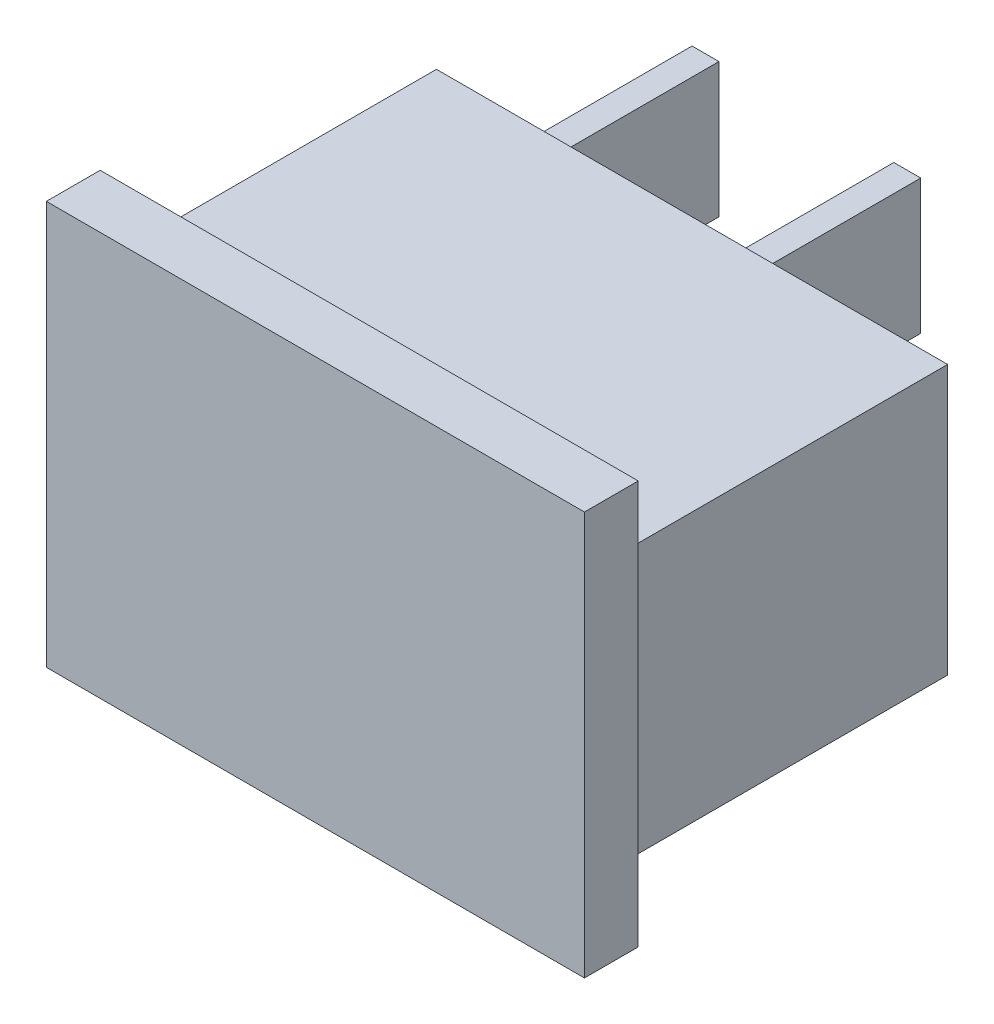
ISO-10303-21;
HEADER;
FILE_DESCRIPTION(('STEP AP214'),'2;1');
FILE_NAME('part.step','',(''),(''),'','','');
FILE_SCHEMA(('AUTOMOTIVE_DESIGN { 1 0 10303 214 1 1 1 1 }'));
ENDSEC;
DATA;
#1=APPLICATION_CONTEXT('core data for automotive mechanical design processes');
#2=APPLICATION_PROTOCOL_DEFINITION('international standard','automotive_design',2000,#1);
#3=PRODUCT_CONTEXT('',#1,'mechanical');
#4=PRODUCT('Part','Part','',(#3));
#5=PRODUCT_RELATED_PRODUCT_CATEGORY('part','',(#4));
#6=PRODUCT_DEFINITION_FORMATION('','',#4);
#7=PRODUCT_DEFINITION_CONTEXT('part definition',#1,'design');
#8=PRODUCT_DEFINITION('design','',#6,#7);
#9=PRODUCT_DEFINITION_SHAPE('','',#8);
#10=(LENGTH_UNIT() NAMED_UNIT(*) SI_UNIT(.MILLI.,.METRE.));
#11=(NAMED_UNIT(*) PLANE_ANGLE_UNIT() SI_UNIT($,.RADIAN.));
#12=(NAMED_UNIT(*) SI_UNIT($,.STERADIAN.) SOLID_ANGLE_UNIT());
#13=UNCERTAINTY_MEASURE_WITH_UNIT(LENGTH_MEASURE(1.E-05),#10,'distance_accuracy_value','');
#14=(GEOMETRIC_REPRESENTATION_CONTEXT(3) GLOBAL_UNCERTAINTY_ASSIGNED_CONTEXT((#13)) GLOBAL_UNIT_ASSIGNED_CONTEXT((#10,
#11,#12)) REPRESENTATION_CONTEXT('',''));
#15=CARTESIAN_POINT('',(0.,0.,0.));
#16=DIRECTION('',(0.,0.,1.));
#17=DIRECTION('',(1.,0.,0.));
#18=AXIS2_PLACEMENT_3D('',#15,#16,#17);
#19=CARTESIAN_POINT('',(0.,10.,-12.));
#20=DIRECTION('',(0.,0.,1.));
#21=DIRECTION('',(1.,0.,0.));
#22=AXIS2_PLACEMENT_3D('',#19,#20,#21);
#23=PLANE('',#22);
#24=DIRECTION('',(0.,1.,0.));
#25=VECTOR('',#24,1.);
#26=CARTESIAN_POINT('',(9.,2.50000000000001,-12.));
#27=LINE('',#26,#25);
#28=CARTESIAN_POINT('',(9.,2.50000000000001,-12.));
#29=VERTEX_POINT('',#28);
#30=CARTESIAN_POINT('',(9.,7.50000000000001,-12.));
#31=VERTEX_POINT('',#30);
#32=EDGE_CURVE('E167',#29,#31,#27,.T.);
#33=ORIENTED_EDGE('',*,*,#32,.F.);
#34=DIRECTION('',(-1.,0.,0.));
#35=VECTOR('',#34,1.);
#36=CARTESIAN_POINT('',(10.,2.50000000000001,-12.));
#37=LINE('',#36,#35);
#38=CARTESIAN_POINT('',(10.,2.50000000000001,-12.));
#39=VERTEX_POINT('',#38);
#40=EDGE_CURVE('E180',#39,#29,#37,.T.);
#41=ORIENTED_EDGE('',*,*,#40,.F.);
#42=DIRECTION('',(0.,-1.,0.));
#43=VECTOR('',#42,1.);
#44=CARTESIAN_POINT('',(10.,2.50000000000001,-12.));
#45=LINE('',#44,#43);
#46=CARTESIAN_POINT('',(10.,7.50000000000001,-12.));
#47=VERTEX_POINT('',#46);
#48=EDGE_CURVE('E189',#47,#39,#45,.T.);
#49=ORIENTED_EDGE('',*,*,#48,.F.);
#50=DIRECTION('',(1.,0.,0.));
#51=VECTOR('',#50,1.);
#52=CARTESIAN_POINT('',(10.,7.50000000000001,-12.));
#53=LINE('',#52,#51);
#54=EDGE_CURVE('E170',#31,#47,#53,.T.);
#55=ORIENTED_EDGE('',*,*,#54,.F.);
#56=EDGE_LOOP('',(#33,#41,#49,#55));
#57=FACE_BOUND('',#56,.T.);
#58=DIRECTION('',(-1.,0.,0.));
#59=VECTOR('',#58,1.);
#60=CARTESIAN_POINT('',(0.,0.,-12.));
#61=LINE('',#60,#59);
#62=CARTESIAN_POINT('',(19.,0.,-12.));
#63=VERTEX_POINT('',#62);
#64=CARTESIAN_POINT('',(0.,0.,-12.));
#65=VERTEX_POINT('',#64);
#66=EDGE_CURVE('E239',#63,#65,#61,.T.);
#67=ORIENTED_EDGE('',*,*,#66,.T.);
#68=DIRECTION('',(0.,-1.,0.));
#69=VECTOR('',#68,1.);
#70=CARTESIAN_POINT('',(0.,10.,-12.));
#71=LINE('',#70,#69);
#72=CARTESIAN_POINT('',(0.,10.,-12.));
#73=VERTEX_POINT('',#72);
#74=EDGE_CURVE('E245',#73,#65,#71,.T.);
#75=ORIENTED_EDGE('',*,*,#74,.F.);
#76=DIRECTION('',(-1.,0.,0.));
#77=VECTOR('',#76,1.);
#78=CARTESIAN_POINT('',(0.,10.,-12.));
#79=LINE('',#78,#77);
#80=CARTESIAN_POINT('',(19.,10.,-12.));
#81=VERTEX_POINT('',#80);
#82=EDGE_CURVE('E243',#81,#73,#79,.T.);
#83=ORIENTED_EDGE('',*,*,#82,.F.);
#84=DIRECTION('',(0.,-1.,0.));
#85=VECTOR('',#84,1.);
#86=CARTESIAN_POINT('',(19.,10.,-12.));
#87=LINE('',#86,#85);
#88=EDGE_CURVE('E255',#81,#63,#87,.T.);
#89=ORIENTED_EDGE('',*,*,#88,.T.);
#90=EDGE_LOOP('',(#67,#75,#83,#89));
#91=FACE_BOUND('',#90,.T.);
#92=DIRECTION('',(0.,1.,0.));
#93=VECTOR('',#92,1.);
#94=CARTESIAN_POINT('',(1.5,2.5,-12.));
#95=LINE('',#94,#93);
#96=CARTESIAN_POINT('',(1.5,2.5,-12.));
#97=VERTEX_POINT('',#96);
#98=CARTESIAN_POINT('',(1.5,7.5,-12.));
#99=VERTEX_POINT('',#98);
#100=EDGE_CURVE('E166',#97,#99,#95,.T.);
#101=ORIENTED_EDGE('',*,*,#100,.F.);
#102=DIRECTION('',(-1.,0.,0.));
#103=VECTOR('',#102,1.);
#104=CARTESIAN_POINT('',(2.5,2.5,-12.));
#105=LINE('',#104,#103);
#106=CARTESIAN_POINT('',(2.5,2.5,-12.));
#107=VERTEX_POINT('',#106);
#108=EDGE_CURVE('E163',#107,#97,#105,.T.);
#109=ORIENTED_EDGE('',*,*,#108,.F.);
#110=DIRECTION('',(0.,-1.,0.));
#111=VECTOR('',#110,1.);
#112=CARTESIAN_POINT('',(2.5,2.5,-12.));
#113=LINE('',#112,#111);
#114=CARTESIAN_POINT('',(2.5,7.5,-12.));
#115=VERTEX_POINT('',#114);
#116=EDGE_CURVE('E53',#115,#107,#113,.T.);
#117=ORIENTED_EDGE('',*,*,#116,.F.);
#118=DIRECTION('',(1.,0.,0.));
#119=VECTOR('',#118,1.);
#120=CARTESIAN_POINT('',(2.5,7.5,-12.));
#121=LINE('',#120,#119);
#122=EDGE_CURVE('E48',#99,#115,#121,.T.);
#123=ORIENTED_EDGE('',*,*,#122,.F.);
#124=EDGE_LOOP('',(#101,#109,#117,#123));
#125=FACE_BOUND('',#124,.T.);
#126=ADVANCED_FACE('F33',(#57,#91,#125),#23,.F.);
#127=CARTESIAN_POINT('',(0.,10.,0.));
#128=DIRECTION('',(1.,0.,0.));
#129=DIRECTION('',(0.,0.,-1.));
#130=AXIS2_PLACEMENT_3D('',#127,#128,#129);
#131=PLANE('',#130);
#132=DIRECTION('',(0.,0.,1.));
#133=VECTOR('',#132,1.);
#134=CARTESIAN_POINT('',(0.,0.,0.));
#135=LINE('',#134,#133);
#136=CARTESIAN_POINT('',(0.,0.,0.));
#137=VERTEX_POINT('',#136);
#138=EDGE_CURVE('E235',#65,#137,#135,.T.);
#139=ORIENTED_EDGE('',*,*,#138,.T.);
#140=DIRECTION('',(0.,-1.,0.));
#141=VECTOR('',#140,1.);
#142=CARTESIAN_POINT('',(0.,10.,0.));
#143=LINE('',#142,#141);
#144=CARTESIAN_POINT('',(0.,10.,0.));
#145=VERTEX_POINT('',#144);
#146=EDGE_CURVE('E11',#145,#137,#143,.T.);
#147=ORIENTED_EDGE('',*,*,#146,.F.);
#148=DIRECTION('',(0.,0.,1.));
#149=VECTOR('',#148,1.);
#150=CARTESIAN_POINT('',(0.,10.,0.));
#151=LINE('',#150,#149);
#152=EDGE_CURVE('E236',#73,#145,#151,.T.);
#153=ORIENTED_EDGE('',*,*,#152,.F.);
#154=ORIENTED_EDGE('',*,*,#74,.T.);
#155=EDGE_LOOP('',(#139,#147,#153,#154));
#156=FACE_BOUND('',#155,.T.);
#157=ADVANCED_FACE('F35',(#156),#131,.F.);
#158=CARTESIAN_POINT('',(19.,10.,0.));
#159=DIRECTION('',(-1.,0.,0.));
#160=DIRECTION('',(0.,0.,1.));
#161=AXIS2_PLACEMENT_3D('',#158,#159,#160);
#162=PLANE('',#161);
#163=DIRECTION('',(0.,0.,-1.));
#164=VECTOR('',#163,1.);
#165=CARTESIAN_POINT('',(19.,0.,0.));
#166=LINE('',#165,#164);
#167=CARTESIAN_POINT('',(19.,0.,0.));
#168=VERTEX_POINT('',#167);
#169=EDGE_CURVE('E250',#168,#63,#166,.T.);
#170=ORIENTED_EDGE('',*,*,#169,.T.);
#171=ORIENTED_EDGE('',*,*,#88,.F.);
#172=DIRECTION('',(0.,0.,-1.));
#173=VECTOR('',#172,1.);
#174=CARTESIAN_POINT('',(19.,10.,0.));
#175=LINE('',#174,#173);
#176=CARTESIAN_POINT('',(19.,10.,0.));
#177=VERTEX_POINT('',#176);
#178=EDGE_CURVE('E241',#177,#81,#175,.T.);
#179=ORIENTED_EDGE('',*,*,#178,.F.);
#180=DIRECTION('',(0.,-1.,0.));
#181=VECTOR('',#180,1.);
#182=CARTESIAN_POINT('',(19.,10.,0.));
#183=LINE('',#182,#181);
#184=EDGE_CURVE('E41',#177,#168,#183,.T.);
#185=ORIENTED_EDGE('',*,*,#184,.T.);
#186=EDGE_LOOP('',(#170,#171,#179,#185));
#187=FACE_BOUND('',#186,.T.);
#188=ADVANCED_FACE('F261',(#187),#162,.F.);
#189=CARTESIAN_POINT('',(0.,10.,0.));
#190=DIRECTION('',(0.,-1.,0.));
#191=DIRECTION('',(0.,0.,-1.));
#192=AXIS2_PLACEMENT_3D('',#189,#190,#191);
#193=PLANE('',#192);
#194=ORIENTED_EDGE('',*,*,#152,.T.);
#195=DIRECTION('',(1.,0.,0.));
#196=VECTOR('',#195,1.);
#197=CARTESIAN_POINT('',(0.,10.,0.));
#198=LINE('',#197,#196);
#199=EDGE_CURVE('E238',#145,#177,#198,.T.);
#200=ORIENTED_EDGE('',*,*,#199,.T.);
#201=ORIENTED_EDGE('',*,*,#178,.T.);
#202=ORIENTED_EDGE('',*,*,#82,.T.);
#203=EDGE_LOOP('',(#194,#200,#201,#202));
#204=FACE_BOUND('',#203,.T.);
#205=ADVANCED_FACE('F278',(#204),#193,.F.);
#206=CARTESIAN_POINT('',(0.,0.,0.));
#207=DIRECTION('',(0.,-1.,0.));
#208=DIRECTION('',(0.,0.,-1.));
#209=AXIS2_PLACEMENT_3D('',#206,#207,#208);
#210=PLANE('',#209);
#211=ORIENTED_EDGE('',*,*,#138,.F.);
#212=ORIENTED_EDGE('',*,*,#66,.F.);
#213=ORIENTED_EDGE('',*,*,#169,.F.);
#214=DIRECTION('',(1.,0.,0.));
#215=VECTOR('',#214,1.);
#216=CARTESIAN_POINT('',(0.,0.,0.));
#217=LINE('',#216,#215);
#218=EDGE_CURVE('E247',#137,#168,#217,.T.);
#219=ORIENTED_EDGE('',*,*,#218,.F.);
#220=EDGE_LOOP('',(#211,#212,#213,#219));
#221=FACE_BOUND('',#220,.T.);
#222=ADVANCED_FACE('F269',(#221),#210,.T.);
#223=CARTESIAN_POINT('',(0.,0.,0.));
#224=DIRECTION('',(0.,0.,1.));
#225=DIRECTION('',(1.,0.,0.));
#226=AXIS2_PLACEMENT_3D('',#223,#224,#225);
#227=PLANE('',#226);
#228=DIRECTION('',(0.,-1.,0.));
#229=VECTOR('',#228,1.);
#230=CARTESIAN_POINT('',(-0.500000000000002,-2.5,0.));
#231=LINE('',#230,#229);
#232=CARTESIAN_POINT('',(-0.500000000000002,12.5,0.));
#233=VERTEX_POINT('',#232);
#234=CARTESIAN_POINT('',(-0.500000000000002,-2.5,0.));
#235=VERTEX_POINT('',#234);
#236=EDGE_CURVE('E205',#233,#235,#231,.T.);
#237=ORIENTED_EDGE('',*,*,#236,.F.);
#238=DIRECTION('',(-1.,0.,0.));
#239=VECTOR('',#238,1.);
#240=CARTESIAN_POINT('',(19.5,12.5,0.));
#241=LINE('',#240,#239);
#242=CARTESIAN_POINT('',(19.5,12.5,0.));
#243=VERTEX_POINT('',#242);
#244=EDGE_CURVE('E210',#243,#233,#241,.T.);
#245=ORIENTED_EDGE('',*,*,#244,.F.);
#246=DIRECTION('',(0.,1.,0.));
#247=VECTOR('',#246,1.);
#248=CARTESIAN_POINT('',(19.5,-2.5,0.));
#249=LINE('',#248,#247);
#250=CARTESIAN_POINT('',(19.5,-2.5,0.));
#251=VERTEX_POINT('',#250);
#252=EDGE_CURVE('E221',#251,#243,#249,.T.);
#253=ORIENTED_EDGE('',*,*,#252,.F.);
#254=DIRECTION('',(1.,0.,0.));
#255=VECTOR('',#254,1.);
#256=CARTESIAN_POINT('',(19.5,-2.5,0.));
#257=LINE('',#256,#255);
#258=EDGE_CURVE('E219',#235,#251,#257,.T.);
#259=ORIENTED_EDGE('',*,*,#258,.F.);
#260=EDGE_LOOP('',(#237,#245,#253,#259));
#261=FACE_BOUND('',#260,.T.);
#262=ORIENTED_EDGE('',*,*,#146,.T.);
#263=ORIENTED_EDGE('',*,*,#218,.T.);
#264=ORIENTED_EDGE('',*,*,#184,.F.);
#265=ORIENTED_EDGE('',*,*,#199,.F.);
#266=EDGE_LOOP('',(#262,#263,#264,#265));
#267=FACE_BOUND('',#266,.T.);
#268=ADVANCED_FACE('F270',(#261,#267),#227,.F.);
#269=CARTESIAN_POINT('',(-0.500000000000002,-2.5,2.));
#270=DIRECTION('',(1.,0.,0.));
#271=DIRECTION('',(0.,0.,-1.));
#272=AXIS2_PLACEMENT_3D('',#269,#270,#271);
#273=PLANE('',#272);
#274=ORIENTED_EDGE('',*,*,#236,.T.);
#275=DIRECTION('',(0.,0.,-1.));
#276=VECTOR('',#275,1.);
#277=CARTESIAN_POINT('',(-0.500000000000002,-2.5,2.));
#278=LINE('',#277,#276);
#279=CARTESIAN_POINT('',(-0.500000000000002,-2.5,2.));
#280=VERTEX_POINT('',#279);
#281=EDGE_CURVE('E232',#280,#235,#278,.T.);
#282=ORIENTED_EDGE('',*,*,#281,.F.);
#283=DIRECTION('',(0.,-1.,0.));
#284=VECTOR('',#283,1.);
#285=CARTESIAN_POINT('',(-0.500000000000002,-2.5,2.));
#286=LINE('',#285,#284);
#287=CARTESIAN_POINT('',(-0.500000000000002,12.5,2.));
#288=VERTEX_POINT('',#287);
#289=EDGE_CURVE('E206',#288,#280,#286,.T.);
#290=ORIENTED_EDGE('',*,*,#289,.F.);
#291=DIRECTION('',(0.,0.,-1.));
#292=VECTOR('',#291,1.);
#293=CARTESIAN_POINT('',(-0.500000000000002,12.5,2.));
#294=LINE('',#293,#292);
#295=EDGE_CURVE('E216',#288,#233,#294,.T.);
#296=ORIENTED_EDGE('',*,*,#295,.T.);
#297=EDGE_LOOP('',(#274,#282,#290,#296));
#298=FACE_BOUND('',#297,.T.);
#299=ADVANCED_FACE('F327',(#298),#273,.F.);
#300=CARTESIAN_POINT('',(19.5,-2.5,2.));
#301=DIRECTION('',(0.,1.,0.));
#302=DIRECTION('',(-1.,0.,0.));
#303=AXIS2_PLACEMENT_3D('',#300,#301,#302);
#304=PLANE('',#303);
#305=ORIENTED_EDGE('',*,*,#258,.T.);
#306=DIRECTION('',(0.,0.,-1.));
#307=VECTOR('',#306,1.);
#308=CARTESIAN_POINT('',(19.5,-2.5,2.));
#309=LINE('',#308,#307);
#310=CARTESIAN_POINT('',(19.5,-2.5,2.));
#311=VERTEX_POINT('',#310);
#312=EDGE_CURVE('E229',#311,#251,#309,.T.);
#313=ORIENTED_EDGE('',*,*,#312,.F.);
#314=DIRECTION('',(1.,0.,0.));
#315=VECTOR('',#314,1.);
#316=CARTESIAN_POINT('',(19.5,-2.5,2.));
#317=LINE('',#316,#315);
#318=EDGE_CURVE('E209',#280,#311,#317,.T.);
#319=ORIENTED_EDGE('',*,*,#318,.F.);
#320=ORIENTED_EDGE('',*,*,#281,.T.);
#321=EDGE_LOOP('',(#305,#313,#319,#320));
#322=FACE_BOUND('',#321,.T.);
#323=ADVANCED_FACE('F335',(#322),#304,.F.);
#324=CARTESIAN_POINT('',(19.5,-2.5,2.));
#325=DIRECTION('',(-1.,0.,0.));
#326=DIRECTION('',(0.,0.,1.));
#327=AXIS2_PLACEMENT_3D('',#324,#325,#326);
#328=PLANE('',#327);
#329=ORIENTED_EDGE('',*,*,#252,.T.);
#330=DIRECTION('',(0.,0.,-1.));
#331=VECTOR('',#330,1.);
#332=CARTESIAN_POINT('',(19.5,12.5,2.));
#333=LINE('',#332,#331);
#334=CARTESIAN_POINT('',(19.5,12.5,2.));
#335=VERTEX_POINT('',#334);
#336=EDGE_CURVE('E226',#335,#243,#333,.T.);
#337=ORIENTED_EDGE('',*,*,#336,.F.);
#338=DIRECTION('',(0.,1.,0.));
#339=VECTOR('',#338,1.);
#340=CARTESIAN_POINT('',(19.5,-2.5,2.));
#341=LINE('',#340,#339);
#342=EDGE_CURVE('E212',#311,#335,#341,.T.);
#343=ORIENTED_EDGE('',*,*,#342,.F.);
#344=ORIENTED_EDGE('',*,*,#312,.T.);
#345=EDGE_LOOP('',(#329,#337,#343,#344));
#346=FACE_BOUND('',#345,.T.);
#347=ADVANCED_FACE('F331',(#346),#328,.F.);
#348=CARTESIAN_POINT('',(19.5,12.5,2.));
#349=DIRECTION('',(0.,-1.,0.));
#350=DIRECTION('',(1.,0.,0.));
#351=AXIS2_PLACEMENT_3D('',#348,#349,#350);
#352=PLANE('',#351);
#353=ORIENTED_EDGE('',*,*,#244,.T.);
#354=ORIENTED_EDGE('',*,*,#295,.F.);
#355=DIRECTION('',(-1.,0.,0.));
#356=VECTOR('',#355,1.);
#357=CARTESIAN_POINT('',(19.5,12.5,2.));
#358=LINE('',#357,#356);
#359=EDGE_CURVE('E214',#335,#288,#358,.T.);
#360=ORIENTED_EDGE('',*,*,#359,.F.);
#361=ORIENTED_EDGE('',*,*,#336,.T.);
#362=EDGE_LOOP('',(#353,#354,#360,#361));
#363=FACE_BOUND('',#362,.T.);
#364=ADVANCED_FACE('F323',(#363),#352,.F.);
#365=CARTESIAN_POINT('',(0.,0.,2.));
#366=DIRECTION('',(0.,0.,1.));
#367=DIRECTION('',(1.,0.,0.));
#368=AXIS2_PLACEMENT_3D('',#365,#366,#367);
#369=PLANE('',#368);
#370=ORIENTED_EDGE('',*,*,#289,.T.);
#371=ORIENTED_EDGE('',*,*,#318,.T.);
#372=ORIENTED_EDGE('',*,*,#342,.T.);
#373=ORIENTED_EDGE('',*,*,#359,.T.);
#374=EDGE_LOOP('',(#370,#371,#372,#373));
#375=FACE_BOUND('',#374,.T.);
#376=ADVANCED_FACE('F317',(#375),#369,.T.);
#377=CARTESIAN_POINT('',(9.,2.50000000000001,-20.));
#378=DIRECTION('',(1.,0.,0.));
#379=DIRECTION('',(0.,0.,-1.));
#380=AXIS2_PLACEMENT_3D('',#377,#378,#379);
#381=PLANE('',#380);
#382=ORIENTED_EDGE('',*,*,#32,.T.);
#383=DIRECTION('',(0.,0.,1.));
#384=VECTOR('',#383,1.);
#385=CARTESIAN_POINT('',(9.,7.50000000000001,-20.));
#386=LINE('',#385,#384);
#387=CARTESIAN_POINT('',(9.,7.50000000000001,-20.));
#388=VERTEX_POINT('',#387);
#389=EDGE_CURVE('E202',#388,#31,#386,.T.);
#390=ORIENTED_EDGE('',*,*,#389,.F.);
#391=DIRECTION('',(0.,1.,0.));
#392=VECTOR('',#391,1.);
#393=CARTESIAN_POINT('',(9.,2.50000000000001,-20.));
#394=LINE('',#393,#392);
#395=CARTESIAN_POINT('',(9.,2.50000000000001,-20.));
#396=VERTEX_POINT('',#395);
#397=EDGE_CURVE('E176',#396,#388,#394,.T.);
#398=ORIENTED_EDGE('',*,*,#397,.F.);
#399=DIRECTION('',(0.,0.,1.));
#400=VECTOR('',#399,1.);
#401=CARTESIAN_POINT('',(9.,2.50000000000001,-20.));
#402=LINE('',#401,#400);
#403=EDGE_CURVE('E185',#396,#29,#402,.T.);
#404=ORIENTED_EDGE('',*,*,#403,.T.);
#405=EDGE_LOOP('',(#382,#390,#398,#404));
#406=FACE_BOUND('',#405,.T.);
#407=ADVANCED_FACE('F301',(#406),#381,.F.);
#408=CARTESIAN_POINT('',(10.,7.50000000000001,-20.));
#409=DIRECTION('',(0.,-1.,0.));
#410=DIRECTION('',(0.,0.,-1.));
#411=AXIS2_PLACEMENT_3D('',#408,#409,#410);
#412=PLANE('',#411);
#413=ORIENTED_EDGE('',*,*,#54,.T.);
#414=DIRECTION('',(0.,0.,1.));
#415=VECTOR('',#414,1.);
#416=CARTESIAN_POINT('',(10.,7.50000000000001,-20.));
#417=LINE('',#416,#415);
#418=CARTESIAN_POINT('',(10.,7.50000000000001,-20.));
#419=VERTEX_POINT('',#418);
#420=EDGE_CURVE('E199',#419,#47,#417,.T.);
#421=ORIENTED_EDGE('',*,*,#420,.F.);
#422=DIRECTION('',(1.,0.,0.));
#423=VECTOR('',#422,1.);
#424=CARTESIAN_POINT('',(10.,7.50000000000001,-20.));
#425=LINE('',#424,#423);
#426=EDGE_CURVE('E179',#388,#419,#425,.T.);
#427=ORIENTED_EDGE('',*,*,#426,.F.);
#428=ORIENTED_EDGE('',*,*,#389,.T.);
#429=EDGE_LOOP('',(#413,#421,#427,#428));
#430=FACE_BOUND('',#429,.T.);
#431=ADVANCED_FACE('F309',(#430),#412,.F.);
#432=CARTESIAN_POINT('',(10.,2.50000000000001,-20.));
#433=DIRECTION('',(-1.,0.,0.));
#434=DIRECTION('',(0.,0.,1.));
#435=AXIS2_PLACEMENT_3D('',#432,#433,#434);
#436=PLANE('',#435);
#437=ORIENTED_EDGE('',*,*,#48,.T.);
#438=DIRECTION('',(0.,0.,1.));
#439=VECTOR('',#438,1.);
#440=CARTESIAN_POINT('',(10.,2.50000000000001,-20.));
#441=LINE('',#440,#439);
#442=CARTESIAN_POINT('',(10.,2.50000000000001,-20.));
#443=VERTEX_POINT('',#442);
#444=EDGE_CURVE('E196',#443,#39,#441,.T.);
#445=ORIENTED_EDGE('',*,*,#444,.F.);
#446=DIRECTION('',(0.,-1.,0.));
#447=VECTOR('',#446,1.);
#448=CARTESIAN_POINT('',(10.,2.50000000000001,-20.));
#449=LINE('',#448,#447);
#450=EDGE_CURVE('E182',#419,#443,#449,.T.);
#451=ORIENTED_EDGE('',*,*,#450,.F.);
#452=ORIENTED_EDGE('',*,*,#420,.T.);
#453=EDGE_LOOP('',(#437,#445,#451,#452));
#454=FACE_BOUND('',#453,.T.);
#455=ADVANCED_FACE('F307',(#454),#436,.F.);
#456=CARTESIAN_POINT('',(10.,2.50000000000001,-20.));
#457=DIRECTION('',(0.,1.,0.));
#458=DIRECTION('',(0.,0.,1.));
#459=AXIS2_PLACEMENT_3D('',#456,#457,#458);
#460=PLANE('',#459);
#461=ORIENTED_EDGE('',*,*,#40,.T.);
#462=ORIENTED_EDGE('',*,*,#403,.F.);
#463=DIRECTION('',(-1.,0.,0.));
#464=VECTOR('',#463,1.);
#465=CARTESIAN_POINT('',(10.,2.50000000000001,-20.));
#466=LINE('',#465,#464);
#467=EDGE_CURVE('E184',#443,#396,#466,.T.);
#468=ORIENTED_EDGE('',*,*,#467,.F.);
#469=ORIENTED_EDGE('',*,*,#444,.T.);
#470=EDGE_LOOP('',(#461,#462,#468,#469));
#471=FACE_BOUND('',#470,.T.);
#472=ADVANCED_FACE('F297',(#471),#460,.F.);
#473=CARTESIAN_POINT('',(0.,0.,-20.));
#474=DIRECTION('',(0.,0.,1.));
#475=DIRECTION('',(1.,0.,0.));
#476=AXIS2_PLACEMENT_3D('',#473,#474,#475);
#477=PLANE('',#476);
#478=ORIENTED_EDGE('',*,*,#397,.T.);
#479=ORIENTED_EDGE('',*,*,#426,.T.);
#480=ORIENTED_EDGE('',*,*,#450,.T.);
#481=ORIENTED_EDGE('',*,*,#467,.T.);
#482=EDGE_LOOP('',(#478,#479,#480,#481));
#483=FACE_BOUND('',#482,.T.);
#484=ADVANCED_FACE('F303',(#483),#477,.F.);
#485=CARTESIAN_POINT('',(1.5,2.5,-20.));
#486=DIRECTION('',(1.,0.,0.));
#487=DIRECTION('',(0.,0.,-1.));
#488=AXIS2_PLACEMENT_3D('',#485,#486,#487);
#489=PLANE('',#488);
#490=ORIENTED_EDGE('',*,*,#100,.T.);
#491=DIRECTION('',(0.,0.,1.));
#492=VECTOR('',#491,1.);
#493=CARTESIAN_POINT('',(1.5,7.5,-20.));
#494=LINE('',#493,#492);
#495=CARTESIAN_POINT('',(1.5,7.5,-20.));
#496=VERTEX_POINT('',#495);
#497=EDGE_CURVE('E147',#496,#99,#494,.T.);
#498=ORIENTED_EDGE('',*,*,#497,.F.);
#499=DIRECTION('',(0.,1.,0.));
#500=VECTOR('',#499,1.);
#501=CARTESIAN_POINT('',(1.5,2.5,-20.));
#502=LINE('',#501,#500);
#503=CARTESIAN_POINT('',(1.5,2.5,-20.));
#504=VERTEX_POINT('',#503);
#505=EDGE_CURVE('E154',#504,#496,#502,.T.);
#506=ORIENTED_EDGE('',*,*,#505,.F.);
#507=DIRECTION('',(0.,0.,1.));
#508=VECTOR('',#507,1.);
#509=CARTESIAN_POINT('',(1.5,2.5,-20.));
#510=LINE('',#509,#508);
#511=EDGE_CURVE('E452',#504,#97,#510,.T.);
#512=ORIENTED_EDGE('',*,*,#511,.T.);
#513=EDGE_LOOP('',(#490,#498,#506,#512));
#514=FACE_BOUND('',#513,.T.);
#515=ADVANCED_FACE('F165',(#514),#489,.F.);
#516=CARTESIAN_POINT('',(2.5,7.5,-20.));
#517=DIRECTION('',(0.,-1.,0.));
#518=DIRECTION('',(0.,0.,-1.));
#519=AXIS2_PLACEMENT_3D('',#516,#517,#518);
#520=PLANE('',#519);
#521=ORIENTED_EDGE('',*,*,#122,.T.);
#522=DIRECTION('',(0.,0.,1.));
#523=VECTOR('',#522,1.);
#524=CARTESIAN_POINT('',(2.5,7.5,-20.));
#525=LINE('',#524,#523);
#526=CARTESIAN_POINT('',(2.5,7.5,-20.));
#527=VERTEX_POINT('',#526);
#528=EDGE_CURVE('E150',#527,#115,#525,.T.);
#529=ORIENTED_EDGE('',*,*,#528,.F.);
#530=DIRECTION('',(1.,0.,0.));
#531=VECTOR('',#530,1.);
#532=CARTESIAN_POINT('',(2.5,7.5,-20.));
#533=LINE('',#532,#531);
#534=EDGE_CURVE('E143',#496,#527,#533,.T.);
#535=ORIENTED_EDGE('',*,*,#534,.F.);
#536=ORIENTED_EDGE('',*,*,#497,.T.);
#537=EDGE_LOOP('',(#521,#529,#535,#536));
#538=FACE_BOUND('',#537,.T.);
#539=ADVANCED_FACE('F145',(#538),#520,.F.);
#540=CARTESIAN_POINT('',(2.5,2.5,-20.));
#541=DIRECTION('',(-1.,0.,0.));
#542=DIRECTION('',(0.,0.,1.));
#543=AXIS2_PLACEMENT_3D('',#540,#541,#542);
#544=PLANE('',#543);
#545=ORIENTED_EDGE('',*,*,#116,.T.);
#546=DIRECTION('',(0.,0.,1.));
#547=VECTOR('',#546,1.);
#548=CARTESIAN_POINT('',(2.5,2.5,-20.));
#549=LINE('',#548,#547);
#550=CARTESIAN_POINT('',(2.5,2.5,-20.));
#551=VERTEX_POINT('',#550);
#552=EDGE_CURVE('E172',#551,#107,#549,.T.);
#553=ORIENTED_EDGE('',*,*,#552,.F.);
#554=DIRECTION('',(0.,-1.,0.));
#555=VECTOR('',#554,1.);
#556=CARTESIAN_POINT('',(2.5,2.5,-20.));
#557=LINE('',#556,#555);
#558=EDGE_CURVE('E153',#527,#551,#557,.T.);
#559=ORIENTED_EDGE('',*,*,#558,.F.);
#560=ORIENTED_EDGE('',*,*,#528,.T.);
#561=EDGE_LOOP('',(#545,#553,#559,#560));
#562=FACE_BOUND('',#561,.T.);
#563=ADVANCED_FACE('F419',(#562),#544,.F.);
#564=CARTESIAN_POINT('',(2.5,2.5,-20.));
#565=DIRECTION('',(0.,1.,0.));
#566=DIRECTION('',(0.,0.,1.));
#567=AXIS2_PLACEMENT_3D('',#564,#565,#566);
#568=PLANE('',#567);
#569=ORIENTED_EDGE('',*,*,#108,.T.);
#570=ORIENTED_EDGE('',*,*,#511,.F.);
#571=DIRECTION('',(-1.,0.,0.));
#572=VECTOR('',#571,1.);
#573=CARTESIAN_POINT('',(2.5,2.5,-20.));
#574=LINE('',#573,#572);
#575=EDGE_CURVE('E159',#551,#504,#574,.T.);
#576=ORIENTED_EDGE('',*,*,#575,.F.);
#577=ORIENTED_EDGE('',*,*,#552,.T.);
#578=EDGE_LOOP('',(#569,#570,#576,#577));
#579=FACE_BOUND('',#578,.T.);
#580=ADVANCED_FACE('F428',(#579),#568,.F.);
#581=CARTESIAN_POINT('',(0.,0.,-20.));
#582=DIRECTION('',(0.,0.,1.));
#583=DIRECTION('',(1.,0.,0.));
#584=AXIS2_PLACEMENT_3D('',#581,#582,#583);
#585=PLANE('',#584);
#586=ORIENTED_EDGE('',*,*,#505,.T.);
#587=ORIENTED_EDGE('',*,*,#534,.T.);
#588=ORIENTED_EDGE('',*,*,#558,.T.);
#589=ORIENTED_EDGE('',*,*,#575,.T.);
#590=EDGE_LOOP('',(#586,#587,#588,#589));
#591=FACE_BOUND('',#590,.T.);
#592=ADVANCED_FACE('F157',(#591),#585,.F.);
#593=CLOSED_SHELL('',(#126,#157,#188,#205,#222,#268,#299,#323,#347,#364,#376,#407,#431,#455,
#472,#484,#515,#539,#563,#580,#592));
#594=MANIFOLD_SOLID_BREP('B2',#593);
#595=ADVANCED_BREP_SHAPE_REPRESENTATION('',(#18,#594),#14);
#596=SHAPE_DEFINITION_REPRESENTATION(#9,#595);
ENDSEC;
END-ISO-10303-21;
